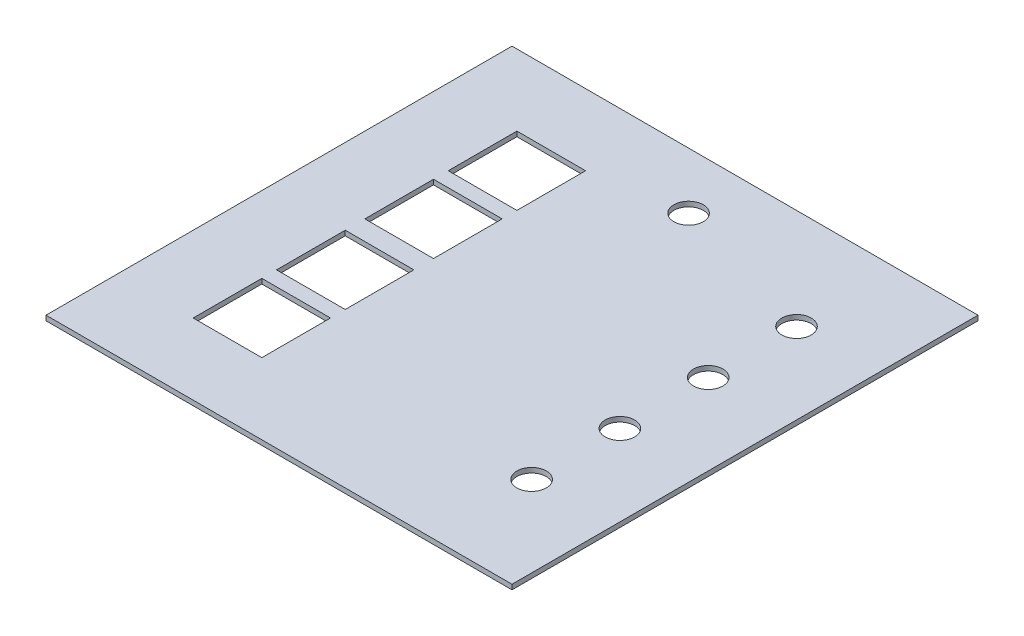
ISO-10303-21;
HEADER;
FILE_DESCRIPTION(('STEP AP214'),'2;1');
FILE_NAME('part.step','',(''),(''),'','','');
FILE_SCHEMA(('AUTOMOTIVE_DESIGN { 1 0 10303 214 1 1 1 1 }'));
ENDSEC;
DATA;
#1=APPLICATION_CONTEXT('core data for automotive mechanical design processes');
#2=APPLICATION_PROTOCOL_DEFINITION('international standard','automotive_design',2000,#1);
#3=PRODUCT_CONTEXT('',#1,'mechanical');
#4=PRODUCT('Part','Part','',(#3));
#5=PRODUCT_RELATED_PRODUCT_CATEGORY('part','',(#4));
#6=PRODUCT_DEFINITION_FORMATION('','',#4);
#7=PRODUCT_DEFINITION_CONTEXT('part definition',#1,'design');
#8=PRODUCT_DEFINITION('design','',#6,#7);
#9=PRODUCT_DEFINITION_SHAPE('','',#8);
#10=(LENGTH_UNIT() NAMED_UNIT(*) SI_UNIT(.MILLI.,.METRE.));
#11=(NAMED_UNIT(*) PLANE_ANGLE_UNIT() SI_UNIT($,.RADIAN.));
#12=(NAMED_UNIT(*) SI_UNIT($,.STERADIAN.) SOLID_ANGLE_UNIT());
#13=UNCERTAINTY_MEASURE_WITH_UNIT(LENGTH_MEASURE(1.E-05),#10,'distance_accuracy_value','');
#14=(GEOMETRIC_REPRESENTATION_CONTEXT(3) GLOBAL_UNCERTAINTY_ASSIGNED_CONTEXT((#13)) GLOBAL_UNIT_ASSIGNED_CONTEXT((#10,
#11,#12)) REPRESENTATION_CONTEXT('',''));
#15=CARTESIAN_POINT('',(0.,0.,0.));
#16=DIRECTION('',(0.,0.,1.));
#17=DIRECTION('',(1.,0.,0.));
#18=AXIS2_PLACEMENT_3D('',#15,#16,#17);
#19=CARTESIAN_POINT('',(0.,1.,0.));
#20=DIRECTION('',(1.,0.,0.));
#21=DIRECTION('',(0.,0.,-1.));
#22=AXIS2_PLACEMENT_3D('',#19,#20,#21);
#23=PLANE('',#22);
#24=DIRECTION('',(0.,0.,1.));
#25=VECTOR('',#24,1.);
#26=CARTESIAN_POINT('',(0.,0.,0.));
#27=LINE('',#26,#25);
#28=CARTESIAN_POINT('',(0.,0.,-95.));
#29=VERTEX_POINT('',#28);
#30=CARTESIAN_POINT('',(0.,0.,0.));
#31=VERTEX_POINT('',#30);
#32=EDGE_CURVE('E395',#29,#31,#27,.T.);
#33=ORIENTED_EDGE('',*,*,#32,.T.);
#34=DIRECTION('',(0.,-1.,0.));
#35=VECTOR('',#34,1.);
#36=CARTESIAN_POINT('',(0.,1.,0.));
#37=LINE('',#36,#35);
#38=CARTESIAN_POINT('',(0.,1.,0.));
#39=VERTEX_POINT('',#38);
#40=EDGE_CURVE('E11',#39,#31,#37,.T.);
#41=ORIENTED_EDGE('',*,*,#40,.F.);
#42=DIRECTION('',(0.,0.,1.));
#43=VECTOR('',#42,1.);
#44=CARTESIAN_POINT('',(0.,1.,0.));
#45=LINE('',#44,#43);
#46=CARTESIAN_POINT('',(0.,1.,-95.));
#47=VERTEX_POINT('',#46);
#48=EDGE_CURVE('E396',#47,#39,#45,.T.);
#49=ORIENTED_EDGE('',*,*,#48,.F.);
#50=DIRECTION('',(0.,-1.,0.));
#51=VECTOR('',#50,1.);
#52=CARTESIAN_POINT('',(0.,1.,-95.));
#53=LINE('',#52,#51);
#54=EDGE_CURVE('E410',#47,#29,#53,.T.);
#55=ORIENTED_EDGE('',*,*,#54,.T.);
#56=EDGE_LOOP('',(#33,#41,#49,#55));
#57=FACE_BOUND('',#56,.T.);
#58=ADVANCED_FACE('F39',(#57),#23,.F.);
#59=CARTESIAN_POINT('',(0.,1.,0.));
#60=DIRECTION('',(0.,0.,-1.));
#61=DIRECTION('',(-1.,0.,0.));
#62=AXIS2_PLACEMENT_3D('',#59,#60,#61);
#63=PLANE('',#62);
#64=DIRECTION('',(1.,0.,0.));
#65=VECTOR('',#64,1.);
#66=CARTESIAN_POINT('',(0.,0.,0.));
#67=LINE('',#66,#65);
#68=CARTESIAN_POINT('',(95.,0.,0.));
#69=VERTEX_POINT('',#68);
#70=EDGE_CURVE('E414',#31,#69,#67,.T.);
#71=ORIENTED_EDGE('',*,*,#70,.T.);
#72=DIRECTION('',(0.,-1.,0.));
#73=VECTOR('',#72,1.);
#74=CARTESIAN_POINT('',(95.,1.,0.));
#75=LINE('',#74,#73);
#76=CARTESIAN_POINT('',(95.,1.,0.));
#77=VERTEX_POINT('',#76);
#78=EDGE_CURVE('E47',#77,#69,#75,.T.);
#79=ORIENTED_EDGE('',*,*,#78,.F.);
#80=DIRECTION('',(1.,0.,0.));
#81=VECTOR('',#80,1.);
#82=CARTESIAN_POINT('',(0.,1.,0.));
#83=LINE('',#82,#81);
#84=EDGE_CURVE('E400',#39,#77,#83,.T.);
#85=ORIENTED_EDGE('',*,*,#84,.F.);
#86=ORIENTED_EDGE('',*,*,#40,.T.);
#87=EDGE_LOOP('',(#71,#79,#85,#86));
#88=FACE_BOUND('',#87,.T.);
#89=ADVANCED_FACE('F449',(#88),#63,.F.);
#90=CARTESIAN_POINT('',(95.,1.,0.));
#91=DIRECTION('',(-1.,0.,0.));
#92=DIRECTION('',(0.,0.,1.));
#93=AXIS2_PLACEMENT_3D('',#90,#91,#92);
#94=PLANE('',#93);
#95=DIRECTION('',(0.,0.,-1.));
#96=VECTOR('',#95,1.);
#97=CARTESIAN_POINT('',(95.,0.,0.));
#98=LINE('',#97,#96);
#99=CARTESIAN_POINT('',(95.,0.,-95.));
#100=VERTEX_POINT('',#99);
#101=EDGE_CURVE('E417',#69,#100,#98,.T.);
#102=ORIENTED_EDGE('',*,*,#101,.T.);
#103=DIRECTION('',(0.,-1.,0.));
#104=VECTOR('',#103,1.);
#105=CARTESIAN_POINT('',(95.,1.,-95.));
#106=LINE('',#105,#104);
#107=CARTESIAN_POINT('',(95.,1.,-95.));
#108=VERTEX_POINT('',#107);
#109=EDGE_CURVE('E425',#108,#100,#106,.T.);
#110=ORIENTED_EDGE('',*,*,#109,.F.);
#111=DIRECTION('',(0.,0.,-1.));
#112=VECTOR('',#111,1.);
#113=CARTESIAN_POINT('',(95.,1.,0.));
#114=LINE('',#113,#112);
#115=EDGE_CURVE('E404',#77,#108,#114,.T.);
#116=ORIENTED_EDGE('',*,*,#115,.F.);
#117=ORIENTED_EDGE('',*,*,#78,.T.);
#118=EDGE_LOOP('',(#102,#110,#116,#117));
#119=FACE_BOUND('',#118,.T.);
#120=ADVANCED_FACE('F434',(#119),#94,.F.);
#121=CARTESIAN_POINT('',(0.,1.,-95.));
#122=DIRECTION('',(0.,0.,1.));
#123=DIRECTION('',(1.,0.,0.));
#124=AXIS2_PLACEMENT_3D('',#121,#122,#123);
#125=PLANE('',#124);
#126=DIRECTION('',(-1.,0.,0.));
#127=VECTOR('',#126,1.);
#128=CARTESIAN_POINT('',(0.,0.,-95.));
#129=LINE('',#128,#127);
#130=EDGE_CURVE('E401',#100,#29,#129,.T.);
#131=ORIENTED_EDGE('',*,*,#130,.T.);
#132=ORIENTED_EDGE('',*,*,#54,.F.);
#133=DIRECTION('',(-1.,0.,0.));
#134=VECTOR('',#133,1.);
#135=CARTESIAN_POINT('',(0.,1.,-95.));
#136=LINE('',#135,#134);
#137=EDGE_CURVE('E407',#108,#47,#136,.T.);
#138=ORIENTED_EDGE('',*,*,#137,.F.);
#139=ORIENTED_EDGE('',*,*,#109,.T.);
#140=EDGE_LOOP('',(#131,#132,#138,#139));
#141=FACE_BOUND('',#140,.T.);
#142=ADVANCED_FACE('F442',(#141),#125,.F.);
#143=CARTESIAN_POINT('',(0.,1.,0.));
#144=DIRECTION('',(0.,-1.,0.));
#145=DIRECTION('',(0.,0.,-1.));
#146=AXIS2_PLACEMENT_3D('',#143,#144,#145);
#147=PLANE('',#146);
#148=DIRECTION('',(1.,0.,0.));
#149=VECTOR('',#148,1.);
#150=CARTESIAN_POINT('',(29.5,1.,-31.5));
#151=LINE('',#150,#149);
#152=CARTESIAN_POINT('',(15.5,1.,-31.5));
#153=VERTEX_POINT('',#152);
#154=CARTESIAN_POINT('',(29.5,1.,-31.5));
#155=VERTEX_POINT('',#154);
#156=EDGE_CURVE('E314',#153,#155,#151,.T.);
#157=ORIENTED_EDGE('',*,*,#156,.F.);
#158=DIRECTION('',(0.,0.,1.));
#159=VECTOR('',#158,1.);
#160=CARTESIAN_POINT('',(15.5,1.,-45.5));
#161=LINE('',#160,#159);
#162=CARTESIAN_POINT('',(15.5,1.,-45.5));
#163=VERTEX_POINT('',#162);
#164=EDGE_CURVE('E318',#163,#153,#161,.T.);
#165=ORIENTED_EDGE('',*,*,#164,.F.);
#166=DIRECTION('',(-1.,0.,0.));
#167=VECTOR('',#166,1.);
#168=CARTESIAN_POINT('',(29.5,1.,-45.5));
#169=LINE('',#168,#167);
#170=CARTESIAN_POINT('',(29.5,1.,-45.5));
#171=VERTEX_POINT('',#170);
#172=EDGE_CURVE('E322',#171,#163,#169,.T.);
#173=ORIENTED_EDGE('',*,*,#172,.F.);
#174=DIRECTION('',(0.,0.,-1.));
#175=VECTOR('',#174,1.);
#176=CARTESIAN_POINT('',(29.5,1.,-45.5));
#177=LINE('',#176,#175);
#178=EDGE_CURVE('E54',#155,#171,#177,.T.);
#179=ORIENTED_EDGE('',*,*,#178,.F.);
#180=EDGE_LOOP('',(#157,#165,#173,#179));
#181=FACE_BOUND('',#180,.T.);
#182=DIRECTION('',(0.,0.,-1.));
#183=VECTOR('',#182,1.);
#184=CARTESIAN_POINT('',(29.5,1.,-14.5));
#185=LINE('',#184,#183);
#186=CARTESIAN_POINT('',(29.5,1.,-14.5));
#187=VERTEX_POINT('',#186);
#188=CARTESIAN_POINT('',(29.5,1.,-28.5));
#189=VERTEX_POINT('',#188);
#190=EDGE_CURVE('E272',#187,#189,#185,.T.);
#191=ORIENTED_EDGE('',*,*,#190,.F.);
#192=DIRECTION('',(1.,0.,0.));
#193=VECTOR('',#192,1.);
#194=CARTESIAN_POINT('',(15.5,1.,-14.5));
#195=LINE('',#194,#193);
#196=CARTESIAN_POINT('',(15.5,1.,-14.5));
#197=VERTEX_POINT('',#196);
#198=EDGE_CURVE('E276',#197,#187,#195,.T.);
#199=ORIENTED_EDGE('',*,*,#198,.F.);
#200=DIRECTION('',(0.,0.,1.));
#201=VECTOR('',#200,1.);
#202=CARTESIAN_POINT('',(15.5,1.,-14.5));
#203=LINE('',#202,#201);
#204=CARTESIAN_POINT('',(15.5,1.,-28.5));
#205=VERTEX_POINT('',#204);
#206=EDGE_CURVE('E280',#205,#197,#203,.T.);
#207=ORIENTED_EDGE('',*,*,#206,.F.);
#208=DIRECTION('',(-1.,0.,0.));
#209=VECTOR('',#208,1.);
#210=CARTESIAN_POINT('',(15.5,1.,-28.5));
#211=LINE('',#210,#209);
#212=EDGE_CURVE('E62',#189,#205,#211,.T.);
#213=ORIENTED_EDGE('',*,*,#212,.F.);
#214=EDGE_LOOP('',(#191,#199,#207,#213));
#215=FACE_BOUND('',#214,.T.);
#216=CARTESIAN_POINT('',(78.5,1.,-20.5));
#217=DIRECTION('',(0.,1.,0.));
#218=DIRECTION('',(0.,0.,-1.));
#219=AXIS2_PLACEMENT_3D('',#216,#217,#218);
#220=CIRCLE('',#219,3.00000000000001);
#221=CARTESIAN_POINT('',(78.5,1.,-23.5));
#222=VERTEX_POINT('',#221);
#223=EDGE_CURVE('E261',#222,#222,#220,.T.);
#224=ORIENTED_EDGE('',*,*,#223,.F.);
#225=EDGE_LOOP('',(#224));
#226=FACE_BOUND('',#225,.T.);
#227=CARTESIAN_POINT('',(78.5,1.,-38.5));
#228=DIRECTION('',(0.,1.,0.));
#229=DIRECTION('',(0.,0.,-1.));
#230=AXIS2_PLACEMENT_3D('',#227,#228,#229);
#231=CIRCLE('',#230,3.00000000000001);
#232=CARTESIAN_POINT('',(78.5,1.,-41.5));
#233=VERTEX_POINT('',#232);
#234=EDGE_CURVE('E253',#233,#233,#231,.T.);
#235=ORIENTED_EDGE('',*,*,#234,.F.);
#236=EDGE_LOOP('',(#235));
#237=FACE_BOUND('',#236,.T.);
#238=CARTESIAN_POINT('',(78.5,1.,-56.5));
#239=DIRECTION('',(0.,1.,0.));
#240=DIRECTION('',(0.,0.,1.));
#241=AXIS2_PLACEMENT_3D('',#238,#239,#240);
#242=CIRCLE('',#241,3.00000000000001);
#243=CARTESIAN_POINT('',(78.5,1.,-53.5));
#244=VERTEX_POINT('',#243);
#245=EDGE_CURVE('E245',#244,#244,#242,.T.);
#246=ORIENTED_EDGE('',*,*,#245,.F.);
#247=EDGE_LOOP('',(#246));
#248=FACE_BOUND('',#247,.T.);
#249=CARTESIAN_POINT('',(78.5,1.,-74.5));
#250=DIRECTION('',(0.,1.,0.));
#251=DIRECTION('',(0.,0.,1.));
#252=AXIS2_PLACEMENT_3D('',#249,#250,#251);
#253=CIRCLE('',#252,3.00000000000001);
#254=CARTESIAN_POINT('',(78.5,1.,-71.5));
#255=VERTEX_POINT('',#254);
#256=EDGE_CURVE('E237',#255,#255,#253,.T.);
#257=ORIENTED_EDGE('',*,*,#256,.F.);
#258=EDGE_LOOP('',(#257));
#259=FACE_BOUND('',#258,.T.);
#260=CARTESIAN_POINT('',(47.5,1.,-83.5));
#261=DIRECTION('',(0.,1.,0.));
#262=DIRECTION('',(0.,0.,1.));
#263=AXIS2_PLACEMENT_3D('',#260,#261,#262);
#264=CIRCLE('',#263,3.);
#265=CARTESIAN_POINT('',(47.5,1.,-80.5));
#266=VERTEX_POINT('',#265);
#267=EDGE_CURVE('E228',#266,#266,#264,.T.);
#268=ORIENTED_EDGE('',*,*,#267,.F.);
#269=EDGE_LOOP('',(#268));
#270=FACE_BOUND('',#269,.T.);
#271=DIRECTION('',(0.,0.,-1.));
#272=VECTOR('',#271,1.);
#273=CARTESIAN_POINT('',(29.5,1.,-80.5));
#274=LINE('',#273,#272);
#275=CARTESIAN_POINT('',(29.5,1.,-66.5));
#276=VERTEX_POINT('',#275);
#277=CARTESIAN_POINT('',(29.5,1.,-80.5));
#278=VERTEX_POINT('',#277);
#279=EDGE_CURVE('E207',#276,#278,#274,.T.);
#280=ORIENTED_EDGE('',*,*,#279,.F.);
#281=DIRECTION('',(1.,0.,0.));
#282=VECTOR('',#281,1.);
#283=CARTESIAN_POINT('',(15.5,1.,-66.5));
#284=LINE('',#283,#282);
#285=CARTESIAN_POINT('',(15.5,1.,-66.5));
#286=VERTEX_POINT('',#285);
#287=EDGE_CURVE('E196',#286,#276,#284,.T.);
#288=ORIENTED_EDGE('',*,*,#287,.F.);
#289=DIRECTION('',(0.,0.,1.));
#290=VECTOR('',#289,1.);
#291=CARTESIAN_POINT('',(15.5,1.,-80.5));
#292=LINE('',#291,#290);
#293=CARTESIAN_POINT('',(15.5,1.,-80.5));
#294=VERTEX_POINT('',#293);
#295=EDGE_CURVE('E211',#294,#286,#292,.T.);
#296=ORIENTED_EDGE('',*,*,#295,.F.);
#297=DIRECTION('',(-1.,0.,0.));
#298=VECTOR('',#297,1.);
#299=CARTESIAN_POINT('',(15.5,1.,-80.5));
#300=LINE('',#299,#298);
#301=EDGE_CURVE('E204',#278,#294,#300,.T.);
#302=ORIENTED_EDGE('',*,*,#301,.F.);
#303=EDGE_LOOP('',(#280,#288,#296,#302));
#304=FACE_BOUND('',#303,.T.);
#305=DIRECTION('',(0.,0.,1.));
#306=VECTOR('',#305,1.);
#307=CARTESIAN_POINT('',(15.5,1.,-49.5));
#308=LINE('',#307,#306);
#309=CARTESIAN_POINT('',(15.5,1.,-63.5));
#310=VERTEX_POINT('',#309);
#311=CARTESIAN_POINT('',(15.5,1.,-49.5));
#312=VERTEX_POINT('',#311);
#313=EDGE_CURVE('E356',#310,#312,#308,.T.);
#314=ORIENTED_EDGE('',*,*,#313,.F.);
#315=DIRECTION('',(-1.,0.,0.));
#316=VECTOR('',#315,1.);
#317=CARTESIAN_POINT('',(29.5,1.,-63.5));
#318=LINE('',#317,#316);
#319=CARTESIAN_POINT('',(29.5,1.,-63.5));
#320=VERTEX_POINT('',#319);
#321=EDGE_CURVE('E360',#320,#310,#318,.T.);
#322=ORIENTED_EDGE('',*,*,#321,.F.);
#323=DIRECTION('',(0.,0.,-1.));
#324=VECTOR('',#323,1.);
#325=CARTESIAN_POINT('',(29.5,1.,-49.5));
#326=LINE('',#325,#324);
#327=CARTESIAN_POINT('',(29.5,1.,-49.5));
#328=VERTEX_POINT('',#327);
#329=EDGE_CURVE('E227',#328,#320,#326,.T.);
#330=ORIENTED_EDGE('',*,*,#329,.F.);
#331=DIRECTION('',(1.,0.,0.));
#332=VECTOR('',#331,1.);
#333=CARTESIAN_POINT('',(29.5,1.,-49.5));
#334=LINE('',#333,#332);
#335=EDGE_CURVE('E352',#312,#328,#334,.T.);
#336=ORIENTED_EDGE('',*,*,#335,.F.);
#337=EDGE_LOOP('',(#314,#322,#330,#336));
#338=FACE_BOUND('',#337,.T.);
#339=ORIENTED_EDGE('',*,*,#48,.T.);
#340=ORIENTED_EDGE('',*,*,#84,.T.);
#341=ORIENTED_EDGE('',*,*,#115,.T.);
#342=ORIENTED_EDGE('',*,*,#137,.T.);
#343=EDGE_LOOP('',(#339,#340,#341,#342));
#344=FACE_BOUND('',#343,.T.);
#345=ADVANCED_FACE('F448',(#181,#215,#226,#237,#248,#259,#270,#304,#338,#344),#147,.F.);
#346=CARTESIAN_POINT('',(0.,0.,0.));
#347=DIRECTION('',(0.,-1.,0.));
#348=DIRECTION('',(0.,0.,-1.));
#349=AXIS2_PLACEMENT_3D('',#346,#347,#348);
#350=PLANE('',#349);
#351=DIRECTION('',(0.,0.,1.));
#352=VECTOR('',#351,1.);
#353=CARTESIAN_POINT('',(15.5,0.,-45.5));
#354=LINE('',#353,#352);
#355=CARTESIAN_POINT('',(15.5,0.,-45.5));
#356=VERTEX_POINT('',#355);
#357=CARTESIAN_POINT('',(15.5,0.,-31.5));
#358=VERTEX_POINT('',#357);
#359=EDGE_CURVE('E313',#356,#358,#354,.T.);
#360=ORIENTED_EDGE('',*,*,#359,.T.);
#361=DIRECTION('',(1.,0.,0.));
#362=VECTOR('',#361,1.);
#363=CARTESIAN_POINT('',(29.5,0.,-31.5));
#364=LINE('',#363,#362);
#365=CARTESIAN_POINT('',(29.5,0.,-31.5));
#366=VERTEX_POINT('',#365);
#367=EDGE_CURVE('E340',#358,#366,#364,.T.);
#368=ORIENTED_EDGE('',*,*,#367,.T.);
#369=DIRECTION('',(0.,0.,-1.));
#370=VECTOR('',#369,1.);
#371=CARTESIAN_POINT('',(29.5,0.,-45.5));
#372=LINE('',#371,#370);
#373=CARTESIAN_POINT('',(29.5,0.,-45.5));
#374=VERTEX_POINT('',#373);
#375=EDGE_CURVE('E335',#366,#374,#372,.T.);
#376=ORIENTED_EDGE('',*,*,#375,.T.);
#377=DIRECTION('',(-1.,0.,0.));
#378=VECTOR('',#377,1.);
#379=CARTESIAN_POINT('',(29.5,0.,-45.5));
#380=LINE('',#379,#378);
#381=EDGE_CURVE('E330',#374,#356,#380,.T.);
#382=ORIENTED_EDGE('',*,*,#381,.T.);
#383=EDGE_LOOP('',(#360,#368,#376,#382));
#384=FACE_BOUND('',#383,.T.);
#385=DIRECTION('',(1.,0.,0.));
#386=VECTOR('',#385,1.);
#387=CARTESIAN_POINT('',(15.5,0.,-14.5));
#388=LINE('',#387,#386);
#389=CARTESIAN_POINT('',(15.5,0.,-14.5));
#390=VERTEX_POINT('',#389);
#391=CARTESIAN_POINT('',(29.5,0.,-14.5));
#392=VERTEX_POINT('',#391);
#393=EDGE_CURVE('E271',#390,#392,#388,.T.);
#394=ORIENTED_EDGE('',*,*,#393,.T.);
#395=DIRECTION('',(0.,0.,-1.));
#396=VECTOR('',#395,1.);
#397=CARTESIAN_POINT('',(29.5,0.,-14.5));
#398=LINE('',#397,#396);
#399=CARTESIAN_POINT('',(29.5,0.,-28.5));
#400=VERTEX_POINT('',#399);
#401=EDGE_CURVE('E299',#392,#400,#398,.T.);
#402=ORIENTED_EDGE('',*,*,#401,.T.);
#403=DIRECTION('',(-1.,0.,0.));
#404=VECTOR('',#403,1.);
#405=CARTESIAN_POINT('',(15.5,0.,-28.5));
#406=LINE('',#405,#404);
#407=CARTESIAN_POINT('',(15.5,0.,-28.5));
#408=VERTEX_POINT('',#407);
#409=EDGE_CURVE('E294',#400,#408,#406,.T.);
#410=ORIENTED_EDGE('',*,*,#409,.T.);
#411=DIRECTION('',(0.,0.,1.));
#412=VECTOR('',#411,1.);
#413=CARTESIAN_POINT('',(15.5,0.,-14.5));
#414=LINE('',#413,#412);
#415=EDGE_CURVE('E289',#408,#390,#414,.T.);
#416=ORIENTED_EDGE('',*,*,#415,.T.);
#417=EDGE_LOOP('',(#394,#402,#410,#416));
#418=FACE_BOUND('',#417,.T.);
#419=CARTESIAN_POINT('',(78.5,0.,-20.5));
#420=DIRECTION('',(0.,-1.,0.));
#421=DIRECTION('',(0.,0.,-1.));
#422=AXIS2_PLACEMENT_3D('',#419,#420,#421);
#423=CIRCLE('',#422,3.00000000000001);
#424=CARTESIAN_POINT('',(78.5,0.,-23.5));
#425=VERTEX_POINT('',#424);
#426=EDGE_CURVE('E257',#425,#425,#423,.F.);
#427=ORIENTED_EDGE('',*,*,#426,.T.);
#428=EDGE_LOOP('',(#427));
#429=FACE_BOUND('',#428,.T.);
#430=CARTESIAN_POINT('',(78.5,0.,-38.5));
#431=DIRECTION('',(0.,-1.,0.));
#432=DIRECTION('',(0.,0.,-1.));
#433=AXIS2_PLACEMENT_3D('',#430,#431,#432);
#434=CIRCLE('',#433,3.00000000000001);
#435=CARTESIAN_POINT('',(78.5,0.,-41.5));
#436=VERTEX_POINT('',#435);
#437=EDGE_CURVE('E249',#436,#436,#434,.F.);
#438=ORIENTED_EDGE('',*,*,#437,.T.);
#439=EDGE_LOOP('',(#438));
#440=FACE_BOUND('',#439,.T.);
#441=CARTESIAN_POINT('',(78.5,0.,-56.5));
#442=DIRECTION('',(0.,-1.,0.));
#443=DIRECTION('',(0.,0.,-1.));
#444=AXIS2_PLACEMENT_3D('',#441,#442,#443);
#445=CIRCLE('',#444,3.00000000000001);
#446=CARTESIAN_POINT('',(78.5,0.,-59.5));
#447=VERTEX_POINT('',#446);
#448=EDGE_CURVE('E241',#447,#447,#445,.F.);
#449=ORIENTED_EDGE('',*,*,#448,.T.);
#450=EDGE_LOOP('',(#449));
#451=FACE_BOUND('',#450,.T.);
#452=CARTESIAN_POINT('',(78.5,0.,-74.5));
#453=DIRECTION('',(0.,-1.,0.));
#454=DIRECTION('',(0.,0.,-1.));
#455=AXIS2_PLACEMENT_3D('',#452,#453,#454);
#456=CIRCLE('',#455,3.00000000000001);
#457=CARTESIAN_POINT('',(78.5,0.,-77.5));
#458=VERTEX_POINT('',#457);
#459=EDGE_CURVE('E233',#458,#458,#456,.F.);
#460=ORIENTED_EDGE('',*,*,#459,.T.);
#461=EDGE_LOOP('',(#460));
#462=FACE_BOUND('',#461,.T.);
#463=CARTESIAN_POINT('',(47.5,0.,-83.5));
#464=DIRECTION('',(0.,-1.,0.));
#465=DIRECTION('',(0.,0.,-1.));
#466=AXIS2_PLACEMENT_3D('',#463,#464,#465);
#467=CIRCLE('',#466,3.);
#468=CARTESIAN_POINT('',(47.5,0.,-86.5));
#469=VERTEX_POINT('',#468);
#470=EDGE_CURVE('E232',#469,#469,#467,.F.);
#471=ORIENTED_EDGE('',*,*,#470,.T.);
#472=EDGE_LOOP('',(#471));
#473=FACE_BOUND('',#472,.T.);
#474=DIRECTION('',(1.,0.,0.));
#475=VECTOR('',#474,1.);
#476=CARTESIAN_POINT('',(15.5,0.,-66.5));
#477=LINE('',#476,#475);
#478=CARTESIAN_POINT('',(15.5,0.,-66.5));
#479=VERTEX_POINT('',#478);
#480=CARTESIAN_POINT('',(29.5,0.,-66.5));
#481=VERTEX_POINT('',#480);
#482=EDGE_CURVE('E193',#479,#481,#477,.T.);
#483=ORIENTED_EDGE('',*,*,#482,.T.);
#484=DIRECTION('',(0.,0.,-1.));
#485=VECTOR('',#484,1.);
#486=CARTESIAN_POINT('',(29.5,0.,-80.5));
#487=LINE('',#486,#485);
#488=CARTESIAN_POINT('',(29.5,0.,-80.5));
#489=VERTEX_POINT('',#488);
#490=EDGE_CURVE('E178',#481,#489,#487,.T.);
#491=ORIENTED_EDGE('',*,*,#490,.T.);
#492=DIRECTION('',(-1.,0.,0.));
#493=VECTOR('',#492,1.);
#494=CARTESIAN_POINT('',(15.5,0.,-80.5));
#495=LINE('',#494,#493);
#496=CARTESIAN_POINT('',(15.5,0.,-80.5));
#497=VERTEX_POINT('',#496);
#498=EDGE_CURVE('E217',#489,#497,#495,.T.);
#499=ORIENTED_EDGE('',*,*,#498,.T.);
#500=DIRECTION('',(0.,0.,1.));
#501=VECTOR('',#500,1.);
#502=CARTESIAN_POINT('',(15.5,0.,-80.5));
#503=LINE('',#502,#501);
#504=EDGE_CURVE('E202',#497,#479,#503,.T.);
#505=ORIENTED_EDGE('',*,*,#504,.T.);
#506=EDGE_LOOP('',(#483,#491,#499,#505));
#507=FACE_BOUND('',#506,.T.);
#508=DIRECTION('',(-1.,0.,0.));
#509=VECTOR('',#508,1.);
#510=CARTESIAN_POINT('',(29.5,0.,-63.5));
#511=LINE('',#510,#509);
#512=CARTESIAN_POINT('',(29.5,0.,-63.5));
#513=VERTEX_POINT('',#512);
#514=CARTESIAN_POINT('',(15.5,0.,-63.5));
#515=VERTEX_POINT('',#514);
#516=EDGE_CURVE('E355',#513,#515,#511,.T.);
#517=ORIENTED_EDGE('',*,*,#516,.T.);
#518=DIRECTION('',(0.,0.,1.));
#519=VECTOR('',#518,1.);
#520=CARTESIAN_POINT('',(15.5,0.,-49.5));
#521=LINE('',#520,#519);
#522=CARTESIAN_POINT('',(15.5,0.,-49.5));
#523=VERTEX_POINT('',#522);
#524=EDGE_CURVE('E382',#515,#523,#521,.T.);
#525=ORIENTED_EDGE('',*,*,#524,.T.);
#526=DIRECTION('',(1.,0.,0.));
#527=VECTOR('',#526,1.);
#528=CARTESIAN_POINT('',(29.5,0.,-49.5));
#529=LINE('',#528,#527);
#530=CARTESIAN_POINT('',(29.5,0.,-49.5));
#531=VERTEX_POINT('',#530);
#532=EDGE_CURVE('E377',#523,#531,#529,.T.);
#533=ORIENTED_EDGE('',*,*,#532,.T.);
#534=DIRECTION('',(0.,0.,-1.));
#535=VECTOR('',#534,1.);
#536=CARTESIAN_POINT('',(29.5,0.,-49.5));
#537=LINE('',#536,#535);
#538=EDGE_CURVE('E371',#531,#513,#537,.T.);
#539=ORIENTED_EDGE('',*,*,#538,.T.);
#540=EDGE_LOOP('',(#517,#525,#533,#539));
#541=FACE_BOUND('',#540,.T.);
#542=ORIENTED_EDGE('',*,*,#32,.F.);
#543=ORIENTED_EDGE('',*,*,#130,.F.);
#544=ORIENTED_EDGE('',*,*,#101,.F.);
#545=ORIENTED_EDGE('',*,*,#70,.F.);
#546=EDGE_LOOP('',(#542,#543,#544,#545));
#547=FACE_BOUND('',#546,.T.);
#548=ADVANCED_FACE('F200',(#384,#418,#429,#440,#451,#462,#473,#507,#541,#547),#350,.T.);
#549=CARTESIAN_POINT('',(29.5,-19.7989898732234,-63.5));
#550=DIRECTION('',(0.,0.,-1.));
#551=DIRECTION('',(-1.,0.,0.));
#552=AXIS2_PLACEMENT_3D('',#549,#550,#551);
#553=PLANE('',#552);
#554=DIRECTION('',(0.,1.,0.));
#555=VECTOR('',#554,1.);
#556=CARTESIAN_POINT('',(29.5,-19.7989898732234,-63.5));
#557=LINE('',#556,#555);
#558=EDGE_CURVE('E375',#513,#320,#557,.T.);
#559=ORIENTED_EDGE('',*,*,#558,.T.);
#560=ORIENTED_EDGE('',*,*,#321,.T.);
#561=DIRECTION('',(0.,1.,0.));
#562=VECTOR('',#561,1.);
#563=CARTESIAN_POINT('',(15.5,-19.7989898732234,-63.5));
#564=LINE('',#563,#562);
#565=EDGE_CURVE('E370',#515,#310,#564,.T.);
#566=ORIENTED_EDGE('',*,*,#565,.F.);
#567=ORIENTED_EDGE('',*,*,#516,.F.);
#568=EDGE_LOOP('',(#559,#560,#566,#567));
#569=FACE_BOUND('',#568,.T.);
#570=ADVANCED_FACE('F461',(#569),#553,.F.);
#571=CARTESIAN_POINT('',(15.5,-19.7989898732234,-49.5));
#572=DIRECTION('',(-1.,0.,0.));
#573=DIRECTION('',(0.,0.,1.));
#574=AXIS2_PLACEMENT_3D('',#571,#572,#573);
#575=PLANE('',#574);
#576=ORIENTED_EDGE('',*,*,#565,.T.);
#577=ORIENTED_EDGE('',*,*,#313,.T.);
#578=DIRECTION('',(0.,1.,0.));
#579=VECTOR('',#578,1.);
#580=CARTESIAN_POINT('',(15.5,-19.7989898732234,-49.5));
#581=LINE('',#580,#579);
#582=EDGE_CURVE('E381',#523,#312,#581,.T.);
#583=ORIENTED_EDGE('',*,*,#582,.F.);
#584=ORIENTED_EDGE('',*,*,#524,.F.);
#585=EDGE_LOOP('',(#576,#577,#583,#584));
#586=FACE_BOUND('',#585,.T.);
#587=ADVANCED_FACE('F468',(#586),#575,.F.);
#588=CARTESIAN_POINT('',(29.5,-19.7989898732234,-49.5));
#589=DIRECTION('',(0.,0.,1.));
#590=DIRECTION('',(1.,0.,0.));
#591=AXIS2_PLACEMENT_3D('',#588,#589,#590);
#592=PLANE('',#591);
#593=ORIENTED_EDGE('',*,*,#582,.T.);
#594=ORIENTED_EDGE('',*,*,#335,.T.);
#595=DIRECTION('',(0.,1.,0.));
#596=VECTOR('',#595,1.);
#597=CARTESIAN_POINT('',(29.5,-19.7989898732234,-49.5));
#598=LINE('',#597,#596);
#599=EDGE_CURVE('E376',#531,#328,#598,.T.);
#600=ORIENTED_EDGE('',*,*,#599,.F.);
#601=ORIENTED_EDGE('',*,*,#532,.F.);
#602=EDGE_LOOP('',(#593,#594,#600,#601));
#603=FACE_BOUND('',#602,.T.);
#604=ADVANCED_FACE('F472',(#603),#592,.F.);
#605=CARTESIAN_POINT('',(29.5,-19.7989898732234,-49.5));
#606=DIRECTION('',(1.,0.,0.));
#607=DIRECTION('',(0.,0.,-1.));
#608=AXIS2_PLACEMENT_3D('',#605,#606,#607);
#609=PLANE('',#608);
#610=ORIENTED_EDGE('',*,*,#599,.T.);
#611=ORIENTED_EDGE('',*,*,#329,.T.);
#612=ORIENTED_EDGE('',*,*,#558,.F.);
#613=ORIENTED_EDGE('',*,*,#538,.F.);
#614=EDGE_LOOP('',(#610,#611,#612,#613));
#615=FACE_BOUND('',#614,.T.);
#616=ADVANCED_FACE('F476',(#615),#609,.F.);
#617=CARTESIAN_POINT('',(15.5,-19.7989898732234,-66.5));
#618=DIRECTION('',(0.,0.,1.));
#619=DIRECTION('',(1.,0.,0.));
#620=AXIS2_PLACEMENT_3D('',#617,#618,#619);
#621=PLANE('',#620);
#622=DIRECTION('',(0.,1.,0.));
#623=VECTOR('',#622,1.);
#624=CARTESIAN_POINT('',(15.5,-19.7989898732234,-66.5));
#625=LINE('',#624,#623);
#626=EDGE_CURVE('E215',#479,#286,#625,.T.);
#627=ORIENTED_EDGE('',*,*,#626,.T.);
#628=ORIENTED_EDGE('',*,*,#287,.T.);
#629=DIRECTION('',(0.,1.,0.));
#630=VECTOR('',#629,1.);
#631=CARTESIAN_POINT('',(29.5,-19.7989898732234,-66.5));
#632=LINE('',#631,#630);
#633=EDGE_CURVE('E182',#481,#276,#632,.T.);
#634=ORIENTED_EDGE('',*,*,#633,.F.);
#635=ORIENTED_EDGE('',*,*,#482,.F.);
#636=EDGE_LOOP('',(#627,#628,#634,#635));
#637=FACE_BOUND('',#636,.T.);
#638=ADVANCED_FACE('F192',(#637),#621,.F.);
#639=CARTESIAN_POINT('',(29.5,-19.7989898732234,-80.5));
#640=DIRECTION('',(1.,0.,0.));
#641=DIRECTION('',(0.,0.,-1.));
#642=AXIS2_PLACEMENT_3D('',#639,#640,#641);
#643=PLANE('',#642);
#644=ORIENTED_EDGE('',*,*,#633,.T.);
#645=ORIENTED_EDGE('',*,*,#279,.T.);
#646=DIRECTION('',(0.,1.,0.));
#647=VECTOR('',#646,1.);
#648=CARTESIAN_POINT('',(29.5,-19.7989898732234,-80.5));
#649=LINE('',#648,#647);
#650=EDGE_CURVE('E184',#489,#278,#649,.T.);
#651=ORIENTED_EDGE('',*,*,#650,.F.);
#652=ORIENTED_EDGE('',*,*,#490,.F.);
#653=EDGE_LOOP('',(#644,#645,#651,#652));
#654=FACE_BOUND('',#653,.T.);
#655=ADVANCED_FACE('F180',(#654),#643,.F.);
#656=CARTESIAN_POINT('',(15.5,-19.7989898732234,-80.5));
#657=DIRECTION('',(0.,0.,-1.));
#658=DIRECTION('',(-1.,0.,0.));
#659=AXIS2_PLACEMENT_3D('',#656,#657,#658);
#660=PLANE('',#659);
#661=ORIENTED_EDGE('',*,*,#650,.T.);
#662=ORIENTED_EDGE('',*,*,#301,.T.);
#663=DIRECTION('',(0.,1.,0.));
#664=VECTOR('',#663,1.);
#665=CARTESIAN_POINT('',(15.5,-19.7989898732234,-80.5));
#666=LINE('',#665,#664);
#667=EDGE_CURVE('E216',#497,#294,#666,.T.);
#668=ORIENTED_EDGE('',*,*,#667,.F.);
#669=ORIENTED_EDGE('',*,*,#498,.F.);
#670=EDGE_LOOP('',(#661,#662,#668,#669));
#671=FACE_BOUND('',#670,.T.);
#672=ADVANCED_FACE('F536',(#671),#660,.F.);
#673=CARTESIAN_POINT('',(15.5,-19.7989898732234,-80.5));
#674=DIRECTION('',(-1.,0.,0.));
#675=DIRECTION('',(0.,0.,1.));
#676=AXIS2_PLACEMENT_3D('',#673,#674,#675);
#677=PLANE('',#676);
#678=ORIENTED_EDGE('',*,*,#667,.T.);
#679=ORIENTED_EDGE('',*,*,#295,.T.);
#680=ORIENTED_EDGE('',*,*,#626,.F.);
#681=ORIENTED_EDGE('',*,*,#504,.F.);
#682=EDGE_LOOP('',(#678,#679,#680,#681));
#683=FACE_BOUND('',#682,.T.);
#684=ADVANCED_FACE('F530',(#683),#677,.F.);
#685=CARTESIAN_POINT('',(47.5,-19.7989898732234,-83.5));
#686=DIRECTION('',(0.,1.,0.));
#687=DIRECTION('',(0.,0.,1.));
#688=AXIS2_PLACEMENT_3D('',#685,#686,#687);
#689=CYLINDRICAL_SURFACE('',#688,3.);
#690=ORIENTED_EDGE('',*,*,#267,.T.);
#691=EDGE_LOOP('',(#690));
#692=FACE_BOUND('',#691,.T.);
#693=ORIENTED_EDGE('',*,*,#470,.F.);
#694=EDGE_LOOP('',(#693));
#695=FACE_BOUND('',#694,.T.);
#696=ADVANCED_FACE('F526',(#692,#695),#689,.F.);
#697=CARTESIAN_POINT('',(78.5,-19.7989898732234,-74.5));
#698=DIRECTION('',(0.,1.,0.));
#699=DIRECTION('',(0.,0.,1.));
#700=AXIS2_PLACEMENT_3D('',#697,#698,#699);
#701=CYLINDRICAL_SURFACE('',#700,3.00000000000001);
#702=ORIENTED_EDGE('',*,*,#256,.T.);
#703=EDGE_LOOP('',(#702));
#704=FACE_BOUND('',#703,.T.);
#705=ORIENTED_EDGE('',*,*,#459,.F.);
#706=EDGE_LOOP('',(#705));
#707=FACE_BOUND('',#706,.T.);
#708=ADVANCED_FACE('F522',(#704,#707),#701,.F.);
#709=CARTESIAN_POINT('',(78.5,-19.7989898732234,-56.5));
#710=DIRECTION('',(0.,1.,0.));
#711=DIRECTION('',(0.,0.,1.));
#712=AXIS2_PLACEMENT_3D('',#709,#710,#711);
#713=CYLINDRICAL_SURFACE('',#712,3.00000000000001);
#714=ORIENTED_EDGE('',*,*,#245,.T.);
#715=EDGE_LOOP('',(#714));
#716=FACE_BOUND('',#715,.T.);
#717=ORIENTED_EDGE('',*,*,#448,.F.);
#718=EDGE_LOOP('',(#717));
#719=FACE_BOUND('',#718,.T.);
#720=ADVANCED_FACE('F518',(#716,#719),#713,.F.);
#721=CARTESIAN_POINT('',(78.5,-19.7989898732234,-38.5));
#722=DIRECTION('',(0.,1.,0.));
#723=DIRECTION('',(0.,0.,1.));
#724=AXIS2_PLACEMENT_3D('',#721,#722,#723);
#725=CYLINDRICAL_SURFACE('',#724,3.00000000000001);
#726=ORIENTED_EDGE('',*,*,#234,.T.);
#727=EDGE_LOOP('',(#726));
#728=FACE_BOUND('',#727,.T.);
#729=ORIENTED_EDGE('',*,*,#437,.F.);
#730=EDGE_LOOP('',(#729));
#731=FACE_BOUND('',#730,.T.);
#732=ADVANCED_FACE('F514',(#728,#731),#725,.F.);
#733=CARTESIAN_POINT('',(78.5,-19.7989898732234,-20.5));
#734=DIRECTION('',(0.,1.,0.));
#735=DIRECTION('',(0.,0.,1.));
#736=AXIS2_PLACEMENT_3D('',#733,#734,#735);
#737=CYLINDRICAL_SURFACE('',#736,3.00000000000001);
#738=ORIENTED_EDGE('',*,*,#223,.T.);
#739=EDGE_LOOP('',(#738));
#740=FACE_BOUND('',#739,.T.);
#741=ORIENTED_EDGE('',*,*,#426,.F.);
#742=EDGE_LOOP('',(#741));
#743=FACE_BOUND('',#742,.T.);
#744=ADVANCED_FACE('F501',(#740,#743),#737,.F.);
#745=CARTESIAN_POINT('',(15.5,-19.7989898732234,-14.5));
#746=DIRECTION('',(0.,0.,1.));
#747=DIRECTION('',(1.,0.,0.));
#748=AXIS2_PLACEMENT_3D('',#745,#746,#747);
#749=PLANE('',#748);
#750=DIRECTION('',(0.,1.,0.));
#751=VECTOR('',#750,1.);
#752=CARTESIAN_POINT('',(15.5,-19.7989898732234,-14.5));
#753=LINE('',#752,#751);
#754=EDGE_CURVE('E265',#390,#197,#753,.T.);
#755=ORIENTED_EDGE('',*,*,#754,.T.);
#756=ORIENTED_EDGE('',*,*,#198,.T.);
#757=DIRECTION('',(0.,1.,0.));
#758=VECTOR('',#757,1.);
#759=CARTESIAN_POINT('',(29.5,-19.7989898732234,-14.5));
#760=LINE('',#759,#758);
#761=EDGE_CURVE('E288',#392,#187,#760,.T.);
#762=ORIENTED_EDGE('',*,*,#761,.F.);
#763=ORIENTED_EDGE('',*,*,#393,.F.);
#764=EDGE_LOOP('',(#755,#756,#762,#763));
#765=FACE_BOUND('',#764,.T.);
#766=ADVANCED_FACE('F497',(#765),#749,.F.);
#767=CARTESIAN_POINT('',(29.5,-19.7989898732234,-14.5));
#768=DIRECTION('',(1.,0.,0.));
#769=DIRECTION('',(0.,0.,-1.));
#770=AXIS2_PLACEMENT_3D('',#767,#768,#769);
#771=PLANE('',#770);
#772=ORIENTED_EDGE('',*,*,#761,.T.);
#773=ORIENTED_EDGE('',*,*,#190,.T.);
#774=DIRECTION('',(0.,1.,0.));
#775=VECTOR('',#774,1.);
#776=CARTESIAN_POINT('',(29.5,-19.7989898732234,-28.5));
#777=LINE('',#776,#775);
#778=EDGE_CURVE('E298',#400,#189,#777,.T.);
#779=ORIENTED_EDGE('',*,*,#778,.F.);
#780=ORIENTED_EDGE('',*,*,#401,.F.);
#781=EDGE_LOOP('',(#772,#773,#779,#780));
#782=FACE_BOUND('',#781,.T.);
#783=ADVANCED_FACE('F500',(#782),#771,.F.);
#784=CARTESIAN_POINT('',(15.5,-19.7989898732234,-28.5));
#785=DIRECTION('',(0.,0.,-1.));
#786=DIRECTION('',(-1.,0.,0.));
#787=AXIS2_PLACEMENT_3D('',#784,#785,#786);
#788=PLANE('',#787);
#789=ORIENTED_EDGE('',*,*,#778,.T.);
#790=ORIENTED_EDGE('',*,*,#212,.T.);
#791=DIRECTION('',(0.,1.,0.));
#792=VECTOR('',#791,1.);
#793=CARTESIAN_POINT('',(15.5,-19.7989898732234,-28.5));
#794=LINE('',#793,#792);
#795=EDGE_CURVE('E293',#408,#205,#794,.T.);
#796=ORIENTED_EDGE('',*,*,#795,.F.);
#797=ORIENTED_EDGE('',*,*,#409,.F.);
#798=EDGE_LOOP('',(#789,#790,#796,#797));
#799=FACE_BOUND('',#798,.T.);
#800=ADVANCED_FACE('F505',(#799),#788,.F.);
#801=CARTESIAN_POINT('',(15.5,-19.7989898732234,-14.5));
#802=DIRECTION('',(-1.,0.,0.));
#803=DIRECTION('',(0.,0.,1.));
#804=AXIS2_PLACEMENT_3D('',#801,#802,#803);
#805=PLANE('',#804);
#806=ORIENTED_EDGE('',*,*,#795,.T.);
#807=ORIENTED_EDGE('',*,*,#206,.T.);
#808=ORIENTED_EDGE('',*,*,#754,.F.);
#809=ORIENTED_EDGE('',*,*,#415,.F.);
#810=EDGE_LOOP('',(#806,#807,#808,#809));
#811=FACE_BOUND('',#810,.T.);
#812=ADVANCED_FACE('F485',(#811),#805,.F.);
#813=CARTESIAN_POINT('',(15.5,-19.7989898732234,-45.5));
#814=DIRECTION('',(-1.,0.,0.));
#815=DIRECTION('',(0.,0.,1.));
#816=AXIS2_PLACEMENT_3D('',#813,#814,#815);
#817=PLANE('',#816);
#818=DIRECTION('',(0.,1.,0.));
#819=VECTOR('',#818,1.);
#820=CARTESIAN_POINT('',(15.5,-19.7989898732234,-45.5));
#821=LINE('',#820,#819);
#822=EDGE_CURVE('E284',#356,#163,#821,.T.);
#823=ORIENTED_EDGE('',*,*,#822,.T.);
#824=ORIENTED_EDGE('',*,*,#164,.T.);
#825=DIRECTION('',(0.,1.,0.));
#826=VECTOR('',#825,1.);
#827=CARTESIAN_POINT('',(15.5,-19.7989898732234,-31.5));
#828=LINE('',#827,#826);
#829=EDGE_CURVE('E329',#358,#153,#828,.T.);
#830=ORIENTED_EDGE('',*,*,#829,.F.);
#831=ORIENTED_EDGE('',*,*,#359,.F.);
#832=EDGE_LOOP('',(#823,#824,#830,#831));
#833=FACE_BOUND('',#832,.T.);
#834=ADVANCED_FACE('F481',(#833),#817,.F.);
#835=CARTESIAN_POINT('',(29.5,-19.7989898732234,-31.5));
#836=DIRECTION('',(0.,0.,1.));
#837=DIRECTION('',(1.,0.,0.));
#838=AXIS2_PLACEMENT_3D('',#835,#836,#837);
#839=PLANE('',#838);
#840=ORIENTED_EDGE('',*,*,#829,.T.);
#841=ORIENTED_EDGE('',*,*,#156,.T.);
#842=DIRECTION('',(0.,1.,0.));
#843=VECTOR('',#842,1.);
#844=CARTESIAN_POINT('',(29.5,-19.7989898732234,-31.5));
#845=LINE('',#844,#843);
#846=EDGE_CURVE('E339',#366,#155,#845,.T.);
#847=ORIENTED_EDGE('',*,*,#846,.F.);
#848=ORIENTED_EDGE('',*,*,#367,.F.);
#849=EDGE_LOOP('',(#840,#841,#847,#848));
#850=FACE_BOUND('',#849,.T.);
#851=ADVANCED_FACE('F484',(#850),#839,.F.);
#852=CARTESIAN_POINT('',(29.5,-19.7989898732234,-45.5));
#853=DIRECTION('',(1.,0.,0.));
#854=DIRECTION('',(0.,0.,-1.));
#855=AXIS2_PLACEMENT_3D('',#852,#853,#854);
#856=PLANE('',#855);
#857=ORIENTED_EDGE('',*,*,#846,.T.);
#858=ORIENTED_EDGE('',*,*,#178,.T.);
#859=DIRECTION('',(0.,1.,0.));
#860=VECTOR('',#859,1.);
#861=CARTESIAN_POINT('',(29.5,-19.7989898732234,-45.5));
#862=LINE('',#861,#860);
#863=EDGE_CURVE('E334',#374,#171,#862,.T.);
#864=ORIENTED_EDGE('',*,*,#863,.F.);
#865=ORIENTED_EDGE('',*,*,#375,.F.);
#866=EDGE_LOOP('',(#857,#858,#864,#865));
#867=FACE_BOUND('',#866,.T.);
#868=ADVANCED_FACE('F489',(#867),#856,.F.);
#869=CARTESIAN_POINT('',(29.5,-19.7989898732234,-45.5));
#870=DIRECTION('',(0.,0.,-1.));
#871=DIRECTION('',(-1.,0.,0.));
#872=AXIS2_PLACEMENT_3D('',#869,#870,#871);
#873=PLANE('',#872);
#874=ORIENTED_EDGE('',*,*,#863,.T.);
#875=ORIENTED_EDGE('',*,*,#172,.T.);
#876=ORIENTED_EDGE('',*,*,#822,.F.);
#877=ORIENTED_EDGE('',*,*,#381,.F.);
#878=EDGE_LOOP('',(#874,#875,#876,#877));
#879=FACE_BOUND('',#878,.T.);
#880=ADVANCED_FACE('F493',(#879),#873,.F.);
#881=CLOSED_SHELL('',(#58,#89,#120,#142,#345,#548,#570,#587,#604,#616,#638,#655,#672,#684,#696,
#708,#720,#732,#744,#766,#783,#800,#812,#834,#851,#868,#880));
#882=MANIFOLD_SOLID_BREP('B2',#881);
#883=ADVANCED_BREP_SHAPE_REPRESENTATION('',(#18,#882),#14);
#884=SHAPE_DEFINITION_REPRESENTATION(#9,#883);
ENDSEC;
END-ISO-10303-21;
